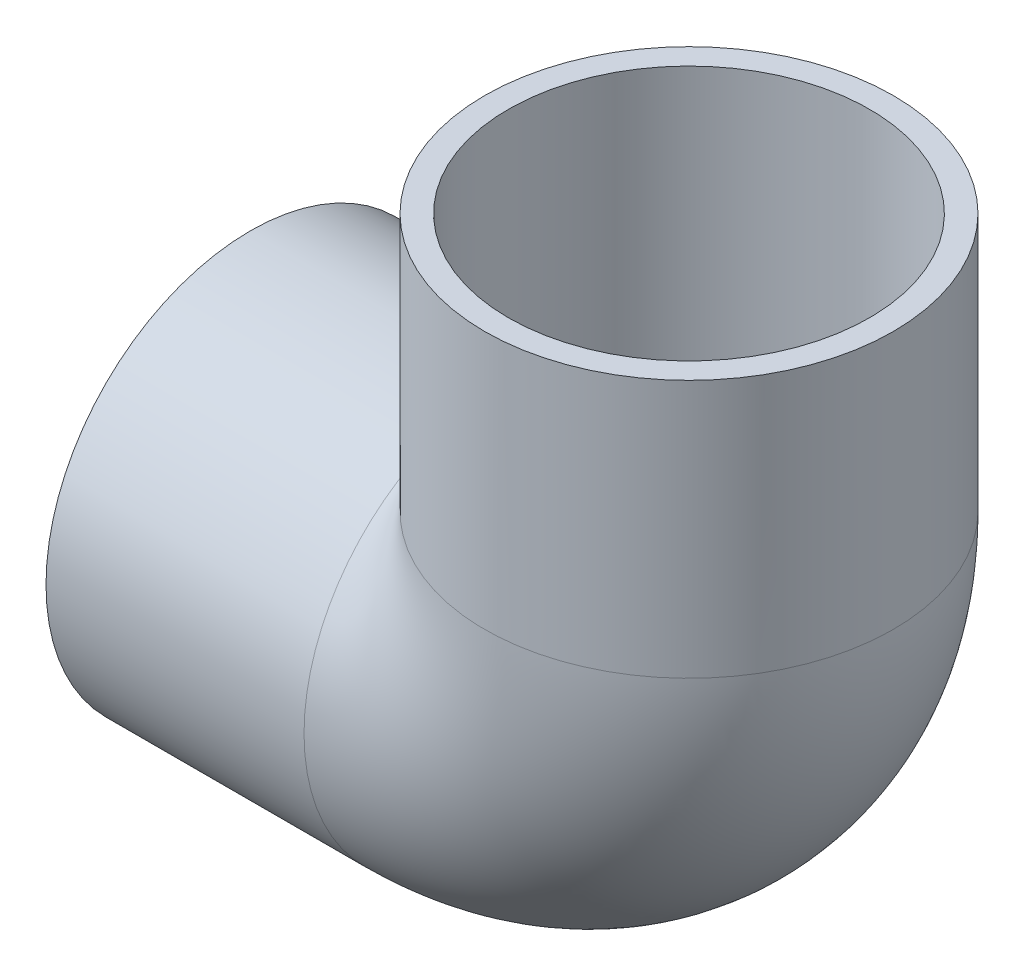
ISO-10303-21;
HEADER;
FILE_DESCRIPTION(('STEP AP214'),'2;1');
FILE_NAME('part.step','',(''),(''),'','','');
FILE_SCHEMA(('AUTOMOTIVE_DESIGN { 1 0 10303 214 1 1 1 1 }'));
ENDSEC;
DATA;
#1=APPLICATION_CONTEXT('core data for automotive mechanical design processes');
#2=APPLICATION_PROTOCOL_DEFINITION('international standard','automotive_design',2000,#1);
#3=PRODUCT_CONTEXT('',#1,'mechanical');
#4=PRODUCT('Part','Part','',(#3));
#5=PRODUCT_RELATED_PRODUCT_CATEGORY('part','',(#4));
#6=PRODUCT_DEFINITION_FORMATION('','',#4);
#7=PRODUCT_DEFINITION_CONTEXT('part definition',#1,'design');
#8=PRODUCT_DEFINITION('design','',#6,#7);
#9=PRODUCT_DEFINITION_SHAPE('','',#8);
#10=(LENGTH_UNIT() NAMED_UNIT(*) SI_UNIT(.MILLI.,.METRE.));
#11=(NAMED_UNIT(*) PLANE_ANGLE_UNIT() SI_UNIT($,.RADIAN.));
#12=(NAMED_UNIT(*) SI_UNIT($,.STERADIAN.) SOLID_ANGLE_UNIT());
#13=UNCERTAINTY_MEASURE_WITH_UNIT(LENGTH_MEASURE(1.E-05),#10,'distance_accuracy_value','');
#14=(GEOMETRIC_REPRESENTATION_CONTEXT(3) GLOBAL_UNCERTAINTY_ASSIGNED_CONTEXT((#13)) GLOBAL_UNIT_ASSIGNED_CONTEXT((#10,
#11,#12)) REPRESENTATION_CONTEXT('',''));
#15=CARTESIAN_POINT('',(0.,0.,0.));
#16=DIRECTION('',(0.,0.,1.));
#17=DIRECTION('',(1.,0.,0.));
#18=AXIS2_PLACEMENT_3D('',#15,#16,#17);
#19=CARTESIAN_POINT('',(-53.975,-25.146,0.));
#20=DIRECTION('',(-1.,0.,0.));
#21=DIRECTION('',(0.,0.,1.));
#22=AXIS2_PLACEMENT_3D('',#19,#20,#21);
#23=PLANE('',#22);
#24=CARTESIAN_POINT('',(-53.975,0.,0.));
#25=DIRECTION('',(-1.,0.,0.));
#26=DIRECTION('',(0.,0.,1.));
#27=AXIS2_PLACEMENT_3D('',#24,#25,#26);
#28=CIRCLE('',#27,25.146);
#29=CARTESIAN_POINT('',(-53.975,0.,25.146));
#30=VERTEX_POINT('',#29);
#31=EDGE_CURVE('E53',#30,#30,#28,.T.);
#32=ORIENTED_EDGE('',*,*,#31,.T.);
#33=EDGE_LOOP('',(#32));
#34=FACE_BOUND('',#33,.T.);
#35=CARTESIAN_POINT('',(-53.975,0.,0.));
#36=DIRECTION('',(-1.,0.,0.));
#37=DIRECTION('',(0.,0.,1.));
#38=AXIS2_PLACEMENT_3D('',#35,#36,#37);
#39=CIRCLE('',#38,21.209);
#40=CARTESIAN_POINT('',(-53.975,0.,21.209));
#41=VERTEX_POINT('',#40);
#42=EDGE_CURVE('E11',#41,#41,#39,.T.);
#43=ORIENTED_EDGE('',*,*,#42,.F.);
#44=EDGE_LOOP('',(#43));
#45=FACE_BOUND('',#44,.T.);
#46=ADVANCED_FACE('F33',(#34,#45),#23,.T.);
#47=CARTESIAN_POINT('',(-22.225,0.,0.));
#48=DIRECTION('',(-1.,0.,0.));
#49=DIRECTION('',(0.,0.,1.));
#50=AXIS2_PLACEMENT_3D('',#47,#48,#49);
#51=CONICAL_SURFACE('',#50,21.0185,0.00599992800155515);
#52=ORIENTED_EDGE('',*,*,#42,.T.);
#53=EDGE_LOOP('',(#52));
#54=FACE_BOUND('',#53,.T.);
#55=CARTESIAN_POINT('',(-22.225,0.,0.));
#56=DIRECTION('',(-1.,0.,0.));
#57=DIRECTION('',(0.,0.,1.));
#58=AXIS2_PLACEMENT_3D('',#55,#56,#57);
#59=CIRCLE('',#58,21.0185);
#60=CARTESIAN_POINT('',(-22.225,0.,21.0185));
#61=VERTEX_POINT('',#60);
#62=EDGE_CURVE('E40',#61,#61,#59,.T.);
#63=ORIENTED_EDGE('',*,*,#62,.F.);
#64=EDGE_LOOP('',(#63));
#65=FACE_BOUND('',#64,.T.);
#66=ADVANCED_FACE('F104',(#54,#65),#51,.F.);
#67=CARTESIAN_POINT('',(-53.975,0.,0.));
#68=DIRECTION('',(-1.,0.,0.));
#69=DIRECTION('',(0.,0.,1.));
#70=AXIS2_PLACEMENT_3D('',#67,#68,#69);
#71=CYLINDRICAL_SURFACE('',#70,25.146);
#72=CARTESIAN_POINT('',(0.,0.,0.));
#73=DIRECTION('',(-0.707106781186547,-0.707106781186547,0.));
#74=DIRECTION('',(-0.707106781186547,0.707106781186547,0.));
#75=AXIS2_PLACEMENT_3D('',#72,#73,#74);
#76=ELLIPSE('',#75,35.5618142394338,25.146);
#77=CARTESIAN_POINT('',(-22.225,22.225,-11.7631072000556));
#78=VERTEX_POINT('',#77);
#79=CARTESIAN_POINT('',(-22.225,22.225,11.7631072000556));
#80=VERTEX_POINT('',#79);
#81=EDGE_CURVE('E52',#78,#80,#76,.F.);
#82=ORIENTED_EDGE('',*,*,#81,.F.);
#83=CARTESIAN_POINT('',(-22.225,0.,0.));
#84=DIRECTION('',(-1.,0.,0.));
#85=DIRECTION('',(0.,0.,1.));
#86=AXIS2_PLACEMENT_3D('',#83,#84,#85);
#87=CIRCLE('',#86,25.146);
#88=EDGE_CURVE('E59',#78,#80,#87,.T.);
#89=ORIENTED_EDGE('',*,*,#88,.T.);
#90=EDGE_LOOP('',(#82,#89));
#91=FACE_BOUND('',#90,.T.);
#92=ORIENTED_EDGE('',*,*,#31,.F.);
#93=EDGE_LOOP('',(#92));
#94=FACE_BOUND('',#93,.T.);
#95=ADVANCED_FACE('F57',(#91,#94),#71,.T.);
#96=CARTESIAN_POINT('',(-22.225,22.225,0.));
#97=DIRECTION('',(0.,0.,-1.));
#98=DIRECTION('',(-1.,0.,0.));
#99=AXIS2_PLACEMENT_3D('',#96,#97,#98);
#100=TOROIDAL_SURFACE('',#99,22.225,17.526);
#101=CARTESIAN_POINT('',(0.,22.225,0.));
#102=DIRECTION('',(0.,1.,0.));
#103=DIRECTION('',(0.,0.,-1.));
#104=AXIS2_PLACEMENT_3D('',#101,#102,#103);
#105=CIRCLE('',#104,17.526);
#106=CARTESIAN_POINT('',(17.526,22.225,0.));
#107=VERTEX_POINT('',#106);
#108=EDGE_CURVE('E54',#107,#107,#105,.T.);
#109=CARTESIAN_POINT('',(-22.225,0.,0.));
#110=DIRECTION('',(1.,0.,0.));
#111=DIRECTION('',(0.,0.,-1.));
#112=AXIS2_PLACEMENT_3D('',#109,#110,#111);
#113=CIRCLE('',#112,17.526);
#114=CARTESIAN_POINT('',(-22.225,-17.526,0.));
#115=VERTEX_POINT('',#114);
#116=EDGE_CURVE('E60',#115,#115,#113,.T.);
#117=CARTESIAN_POINT('',(-22.225,22.225,0.));
#118=DIRECTION('',(0.,0.,-1.));
#119=DIRECTION('',(-1.,0.,0.));
#120=AXIS2_PLACEMENT_3D('',#117,#118,#119);
#121=CIRCLE('',#120,39.751);
#122=EDGE_CURVE('',#107,#115,#121,.T.);
#123=ORIENTED_EDGE('',*,*,#108,.T.);
#124=ORIENTED_EDGE('',*,*,#116,.F.);
#125=ORIENTED_EDGE('',*,*,#122,.T.);
#126=ORIENTED_EDGE('',*,*,#122,.F.);
#127=EDGE_LOOP('',(#123,#125,#124,#126));
#128=FACE_BOUND('',#127,.T.);
#129=ADVANCED_FACE('F121',(#128),#100,.F.);
#130=CARTESIAN_POINT('',(-44.45,22.225,0.));
#131=DIRECTION('',(0.,-1.,0.));
#132=DIRECTION('',(-1.,0.,0.));
#133=AXIS2_PLACEMENT_3D('',#130,#131,#132);
#134=CIRCLE('',#133,25.146);
#135=TRIMMED_CURVE('',#134,(PARAMETER_VALUE(-2.6548012951665)),
(PARAMETER_VALUE(2.6548012951665)),.T.,.PARAMETER.);
#136=CARTESIAN_POINT('',(-22.225,22.225,0.));
#137=DIRECTION('',(0.,0.,-1.));
#138=AXIS1_PLACEMENT('',#136,#137);
#139=SURFACE_OF_REVOLUTION('',#135,#138);
#140=CARTESIAN_POINT('',(0.,22.225,0.));
#141=DIRECTION('',(0.,1.,0.));
#142=DIRECTION('',(0.,0.,-1.));
#143=AXIS2_PLACEMENT_3D('',#140,#141,#142);
#144=CIRCLE('',#143,25.146);
#145=EDGE_CURVE('E46',#80,#78,#144,.T.);
#146=ORIENTED_EDGE('',*,*,#145,.F.);
#147=ORIENTED_EDGE('',*,*,#88,.F.);
#148=EDGE_LOOP('',(#146,#147));
#149=FACE_BOUND('',#148,.T.);
#150=ADVANCED_FACE('F63',(#149),#139,.T.);
#151=CARTESIAN_POINT('',(0.,22.225,0.));
#152=DIRECTION('',(0.,1.,0.));
#153=DIRECTION('',(0.,0.,-1.));
#154=AXIS2_PLACEMENT_3D('',#151,#152,#153);
#155=PLANE('',#154);
#156=ORIENTED_EDGE('',*,*,#108,.F.);
#157=EDGE_LOOP('',(#156));
#158=FACE_BOUND('',#157,.T.);
#159=CARTESIAN_POINT('',(0.,22.225,0.));
#160=DIRECTION('',(0.,1.,0.));
#161=DIRECTION('',(0.,0.,1.));
#162=AXIS2_PLACEMENT_3D('',#159,#160,#161);
#163=CIRCLE('',#162,22.225);
#164=CARTESIAN_POINT('',(0.,22.225,22.225));
#165=VERTEX_POINT('',#164);
#166=EDGE_CURVE('E75',#165,#165,#163,.T.);
#167=ORIENTED_EDGE('',*,*,#166,.T.);
#168=EDGE_LOOP('',(#167));
#169=FACE_BOUND('',#168,.T.);
#170=ADVANCED_FACE('F82',(#158,#169),#155,.T.);
#171=CARTESIAN_POINT('',(-22.225,0.,0.));
#172=DIRECTION('',(1.,0.,0.));
#173=DIRECTION('',(0.,0.,-1.));
#174=AXIS2_PLACEMENT_3D('',#171,#172,#173);
#175=PLANE('',#174);
#176=ORIENTED_EDGE('',*,*,#62,.T.);
#177=EDGE_LOOP('',(#176));
#178=FACE_BOUND('',#177,.T.);
#179=ORIENTED_EDGE('',*,*,#116,.T.);
#180=EDGE_LOOP('',(#179));
#181=FACE_BOUND('',#180,.T.);
#182=ADVANCED_FACE('F93',(#178,#181),#175,.F.);
#183=CARTESIAN_POINT('',(25.146,53.975,0.));
#184=DIRECTION('',(0.,1.,0.));
#185=DIRECTION('',(0.,0.,1.));
#186=AXIS2_PLACEMENT_3D('',#183,#184,#185);
#187=PLANE('',#186);
#188=CARTESIAN_POINT('',(0.,53.975,0.));
#189=DIRECTION('',(0.,1.,0.));
#190=DIRECTION('',(0.,0.,1.));
#191=AXIS2_PLACEMENT_3D('',#188,#189,#190);
#192=CIRCLE('',#191,22.225);
#193=CARTESIAN_POINT('',(0.,53.975,22.225));
#194=VERTEX_POINT('',#193);
#195=EDGE_CURVE('E76',#194,#194,#192,.T.);
#196=ORIENTED_EDGE('',*,*,#195,.F.);
#197=EDGE_LOOP('',(#196));
#198=FACE_BOUND('',#197,.T.);
#199=CARTESIAN_POINT('',(0.,53.975,0.));
#200=DIRECTION('',(0.,-1.,0.));
#201=DIRECTION('',(0.,0.,-1.));
#202=AXIS2_PLACEMENT_3D('',#199,#200,#201);
#203=CIRCLE('',#202,25.146);
#204=CARTESIAN_POINT('',(0.,53.975,-25.146));
#205=VERTEX_POINT('',#204);
#206=EDGE_CURVE('E61',#205,#205,#203,.T.);
#207=ORIENTED_EDGE('',*,*,#206,.F.);
#208=EDGE_LOOP('',(#207));
#209=FACE_BOUND('',#208,.T.);
#210=ADVANCED_FACE('F90',(#198,#209),#187,.T.);
#211=CARTESIAN_POINT('',(0.,0.,0.));
#212=DIRECTION('',(0.,-1.,0.));
#213=DIRECTION('',(0.,0.,-1.));
#214=AXIS2_PLACEMENT_3D('',#211,#212,#213);
#215=CYLINDRICAL_SURFACE('',#214,25.146);
#216=ORIENTED_EDGE('',*,*,#206,.T.);
#217=EDGE_LOOP('',(#216));
#218=FACE_BOUND('',#217,.T.);
#219=ORIENTED_EDGE('',*,*,#145,.T.);
#220=ORIENTED_EDGE('',*,*,#81,.T.);
#221=EDGE_LOOP('',(#219,#220));
#222=FACE_BOUND('',#221,.T.);
#223=ADVANCED_FACE('F51',(#218,#222),#215,.T.);
#224=CARTESIAN_POINT('',(0.,22.225,0.));
#225=DIRECTION('',(0.,1.,0.));
#226=DIRECTION('',(0.,0.,1.));
#227=AXIS2_PLACEMENT_3D('',#224,#225,#226);
#228=CYLINDRICAL_SURFACE('',#227,22.225);
#229=ORIENTED_EDGE('',*,*,#166,.F.);
#230=EDGE_LOOP('',(#229));
#231=FACE_BOUND('',#230,.T.);
#232=ORIENTED_EDGE('',*,*,#195,.T.);
#233=EDGE_LOOP('',(#232));
#234=FACE_BOUND('',#233,.T.);
#235=ADVANCED_FACE('F84',(#231,#234),#228,.F.);
#236=CLOSED_SHELL('',(#46,#66,#95,#129,#150,#170,#182,#210,#223,#235));
#237=MANIFOLD_SOLID_BREP('B2',#236);
#238=ADVANCED_BREP_SHAPE_REPRESENTATION('',(#18,#237),#14);
#239=SHAPE_DEFINITION_REPRESENTATION(#9,#238);
ENDSEC;
END-ISO-10303-21;
